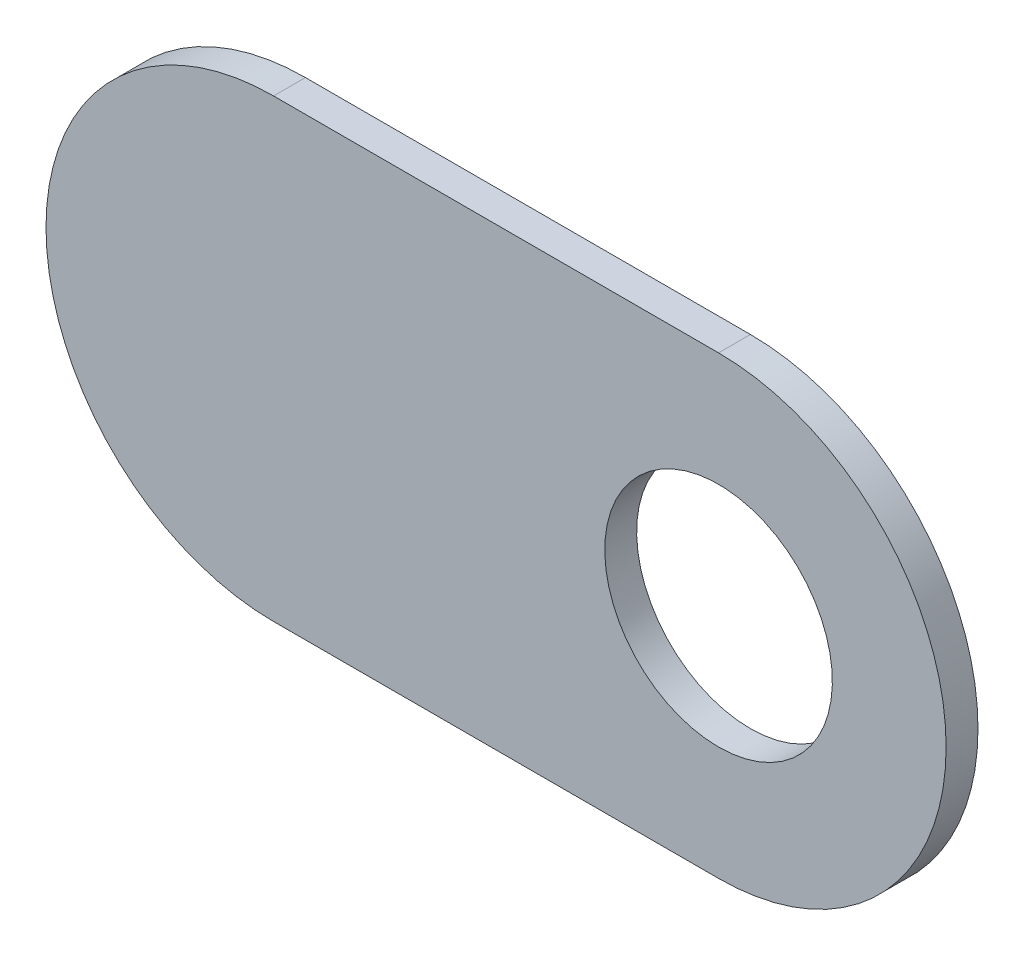
ISO-10303-21;
HEADER;
FILE_DESCRIPTION(('STEP AP214'),'2;1');
FILE_NAME('part.step','',(''),(''),'','','');
FILE_SCHEMA(('AUTOMOTIVE_DESIGN { 1 0 10303 214 1 1 1 1 }'));
ENDSEC;
DATA;
#1=APPLICATION_CONTEXT('core data for automotive mechanical design processes');
#2=APPLICATION_PROTOCOL_DEFINITION('international standard','automotive_design',2000,#1);
#3=PRODUCT_CONTEXT('',#1,'mechanical');
#4=PRODUCT('Part','Part','',(#3));
#5=PRODUCT_RELATED_PRODUCT_CATEGORY('part','',(#4));
#6=PRODUCT_DEFINITION_FORMATION('','',#4);
#7=PRODUCT_DEFINITION_CONTEXT('part definition',#1,'design');
#8=PRODUCT_DEFINITION('design','',#6,#7);
#9=PRODUCT_DEFINITION_SHAPE('','',#8);
#10=(LENGTH_UNIT() NAMED_UNIT(*) SI_UNIT(.MILLI.,.METRE.));
#11=(NAMED_UNIT(*) PLANE_ANGLE_UNIT() SI_UNIT($,.RADIAN.));
#12=(NAMED_UNIT(*) SI_UNIT($,.STERADIAN.) SOLID_ANGLE_UNIT());
#13=UNCERTAINTY_MEASURE_WITH_UNIT(LENGTH_MEASURE(1.E-05),#10,'distance_accuracy_value','');
#14=(GEOMETRIC_REPRESENTATION_CONTEXT(3) GLOBAL_UNCERTAINTY_ASSIGNED_CONTEXT((#13)) GLOBAL_UNIT_ASSIGNED_CONTEXT((#10,
#11,#12)) REPRESENTATION_CONTEXT('',''));
#15=CARTESIAN_POINT('',(0.,0.,0.));
#16=DIRECTION('',(0.,0.,1.));
#17=DIRECTION('',(1.,0.,0.));
#18=AXIS2_PLACEMENT_3D('',#15,#16,#17);
#19=CARTESIAN_POINT('',(96.84,-125.,-0.045));
#20=DIRECTION('',(0.,0.,-1.));
#21=DIRECTION('',(0.,-1.,0.));
#22=AXIS2_PLACEMENT_3D('',#19,#20,#21);
#23=CYLINDRICAL_SURFACE('',#22,0.125);
#24=CARTESIAN_POINT('',(96.84,-125.,1.6));
#25=DIRECTION('',(0.,0.,-1.));
#26=DIRECTION('',(0.,-1.,0.));
#27=AXIS2_PLACEMENT_3D('',#24,#25,#26);
#28=CIRCLE('',#27,0.125);
#29=CARTESIAN_POINT('',(96.84,-125.125,1.6));
#30=VERTEX_POINT('',#29);
#31=EDGE_CURVE('E129',#30,#30,#28,.T.);
#32=ORIENTED_EDGE('',*,*,#31,.T.);
#33=DIRECTION('',(0.,0.,1.));
#34=VECTOR('',#33,1.);
#35=CARTESIAN_POINT('',(96.84,-125.125,-0.045));
#36=LINE('',#35,#34);
#37=CARTESIAN_POINT('',(96.84,-125.125,1.635));
#38=VERTEX_POINT('',#37);
#39=EDGE_CURVE('E11',#30,#38,#36,.T.);
#40=ORIENTED_EDGE('',*,*,#39,.T.);
#41=CARTESIAN_POINT('',(96.84,-125.,1.635));
#42=DIRECTION('',(0.,0.,-1.));
#43=DIRECTION('',(0.,-1.,0.));
#44=AXIS2_PLACEMENT_3D('',#41,#42,#43);
#45=CIRCLE('',#44,0.125);
#46=EDGE_CURVE('E21',#38,#38,#45,.T.);
#47=ORIENTED_EDGE('',*,*,#46,.F.);
#48=ORIENTED_EDGE('',*,*,#39,.F.);
#49=EDGE_LOOP('',(#32,#40,#47,#48));
#50=FACE_BOUND('',#49,.T.);
#51=ADVANCED_FACE('F17',(#50),#23,.F.);
#52=CARTESIAN_POINT('',(96.351178,-125.25,1.6));
#53=DIRECTION('',(0.,1.,0.));
#54=DIRECTION('',(1.,0.,0.));
#55=AXIS2_PLACEMENT_3D('',#52,#53,#54);
#56=PLANE('',#55);
#57=DIRECTION('',(1.,0.,0.));
#58=VECTOR('',#57,1.);
#59=CARTESIAN_POINT('',(96.351178,-125.25,1.6));
#60=LINE('',#59,#58);
#61=CARTESIAN_POINT('',(96.351178,-125.25,1.6));
#62=VERTEX_POINT('',#61);
#63=CARTESIAN_POINT('',(96.84,-125.25,1.6));
#64=VERTEX_POINT('',#63);
#65=EDGE_CURVE('E120',#62,#64,#60,.T.);
#66=ORIENTED_EDGE('',*,*,#65,.T.);
#67=DIRECTION('',(0.,0.,1.));
#68=VECTOR('',#67,1.);
#69=CARTESIAN_POINT('',(96.84,-125.25,1.6));
#70=LINE('',#69,#68);
#71=CARTESIAN_POINT('',(96.84,-125.25,1.635));
#72=VERTEX_POINT('',#71);
#73=EDGE_CURVE('E85',#64,#72,#70,.T.);
#74=ORIENTED_EDGE('',*,*,#73,.T.);
#75=DIRECTION('',(1.,0.,0.));
#76=VECTOR('',#75,1.);
#77=CARTESIAN_POINT('',(96.351178,-125.25,1.635));
#78=LINE('',#77,#76);
#79=CARTESIAN_POINT('',(96.351178,-125.25,1.635));
#80=VERTEX_POINT('',#79);
#81=EDGE_CURVE('E113',#80,#72,#78,.T.);
#82=ORIENTED_EDGE('',*,*,#81,.F.);
#83=DIRECTION('',(0.,0.,1.));
#84=VECTOR('',#83,1.);
#85=CARTESIAN_POINT('',(96.351178,-125.25,1.6));
#86=LINE('',#85,#84);
#87=EDGE_CURVE('E121',#62,#80,#86,.T.);
#88=ORIENTED_EDGE('',*,*,#87,.F.);
#89=EDGE_LOOP('',(#66,#74,#82,#88));
#90=FACE_BOUND('',#89,.T.);
#91=ADVANCED_FACE('F139',(#90),#56,.F.);
#92=CARTESIAN_POINT('',(96.84,-124.75,1.635));
#93=DIRECTION('',(0.,0.,1.));
#94=DIRECTION('',(1.,0.,0.));
#95=AXIS2_PLACEMENT_3D('',#92,#93,#94);
#96=PLANE('',#95);
#97=ORIENTED_EDGE('',*,*,#46,.T.);
#98=EDGE_LOOP('',(#97));
#99=FACE_BOUND('',#98,.T.);
#100=DIRECTION('',(-1.,0.,0.));
#101=VECTOR('',#100,1.);
#102=CARTESIAN_POINT('',(96.84,-124.75,1.635));
#103=LINE('',#102,#101);
#104=CARTESIAN_POINT('',(96.84,-124.75,1.635));
#105=VERTEX_POINT('',#104);
#106=CARTESIAN_POINT('',(96.351178,-124.75,1.635));
#107=VERTEX_POINT('',#106);
#108=EDGE_CURVE('E97',#105,#107,#103,.T.);
#109=ORIENTED_EDGE('',*,*,#108,.T.);
#110=CARTESIAN_POINT('',(96.351178,-125.,1.635));
#111=DIRECTION('',(0.,0.,1.));
#112=DIRECTION('',(0.,1.,0.));
#113=AXIS2_PLACEMENT_3D('',#110,#111,#112);
#114=CIRCLE('',#113,0.25);
#115=EDGE_CURVE('E117',#107,#80,#114,.T.);
#116=ORIENTED_EDGE('',*,*,#115,.T.);
#117=ORIENTED_EDGE('',*,*,#81,.T.);
#118=CARTESIAN_POINT('',(96.84,-125.,1.635));
#119=DIRECTION('',(0.,0.,1.));
#120=DIRECTION('',(0.,-1.,0.));
#121=AXIS2_PLACEMENT_3D('',#118,#119,#120);
#122=CIRCLE('',#121,0.25);
#123=EDGE_CURVE('E89',#72,#105,#122,.T.);
#124=ORIENTED_EDGE('',*,*,#123,.T.);
#125=EDGE_LOOP('',(#109,#116,#117,#124));
#126=FACE_BOUND('',#125,.T.);
#127=ADVANCED_FACE('F19',(#99,#126),#96,.T.);
#128=CARTESIAN_POINT('',(96.84,-124.75,1.6));
#129=DIRECTION('',(0.,0.,1.));
#130=DIRECTION('',(1.,0.,0.));
#131=AXIS2_PLACEMENT_3D('',#128,#129,#130);
#132=PLANE('',#131);
#133=ORIENTED_EDGE('',*,*,#31,.F.);
#134=EDGE_LOOP('',(#133));
#135=FACE_BOUND('',#134,.T.);
#136=CARTESIAN_POINT('',(96.84,-125.,1.6));
#137=DIRECTION('',(0.,0.,1.));
#138=DIRECTION('',(0.,-1.,0.));
#139=AXIS2_PLACEMENT_3D('',#136,#137,#138);
#140=CIRCLE('',#139,0.25);
#141=CARTESIAN_POINT('',(96.84,-124.75,1.6));
#142=VERTEX_POINT('',#141);
#143=EDGE_CURVE('E78',#64,#142,#140,.T.);
#144=ORIENTED_EDGE('',*,*,#143,.F.);
#145=ORIENTED_EDGE('',*,*,#65,.F.);
#146=CARTESIAN_POINT('',(96.351178,-125.,1.6));
#147=DIRECTION('',(0.,0.,1.));
#148=DIRECTION('',(0.,1.,0.));
#149=AXIS2_PLACEMENT_3D('',#146,#147,#148);
#150=CIRCLE('',#149,0.25);
#151=CARTESIAN_POINT('',(96.351178,-124.75,1.6));
#152=VERTEX_POINT('',#151);
#153=EDGE_CURVE('E102',#152,#62,#150,.T.);
#154=ORIENTED_EDGE('',*,*,#153,.F.);
#155=DIRECTION('',(-1.,0.,0.));
#156=VECTOR('',#155,1.);
#157=CARTESIAN_POINT('',(96.84,-124.75,1.6));
#158=LINE('',#157,#156);
#159=EDGE_CURVE('E95',#142,#152,#158,.T.);
#160=ORIENTED_EDGE('',*,*,#159,.F.);
#161=EDGE_LOOP('',(#144,#145,#154,#160));
#162=FACE_BOUND('',#161,.T.);
#163=ADVANCED_FACE('F100',(#135,#162),#132,.F.);
#164=CARTESIAN_POINT('',(96.351178,-125.,1.6));
#165=DIRECTION('',(0.,0.,-1.));
#166=DIRECTION('',(0.,1.,0.));
#167=AXIS2_PLACEMENT_3D('',#164,#165,#166);
#168=CYLINDRICAL_SURFACE('',#167,0.25);
#169=ORIENTED_EDGE('',*,*,#153,.T.);
#170=ORIENTED_EDGE('',*,*,#87,.T.);
#171=ORIENTED_EDGE('',*,*,#115,.F.);
#172=DIRECTION('',(0.,0.,1.));
#173=VECTOR('',#172,1.);
#174=CARTESIAN_POINT('',(96.351178,-124.75,1.6));
#175=LINE('',#174,#173);
#176=EDGE_CURVE('E105',#152,#107,#175,.T.);
#177=ORIENTED_EDGE('',*,*,#176,.F.);
#178=EDGE_LOOP('',(#169,#170,#171,#177));
#179=FACE_BOUND('',#178,.T.);
#180=ADVANCED_FACE('F141',(#179),#168,.T.);
#181=CARTESIAN_POINT('',(96.84,-125.,1.6));
#182=DIRECTION('',(0.,0.,-1.));
#183=DIRECTION('',(0.,-1.,0.));
#184=AXIS2_PLACEMENT_3D('',#181,#182,#183);
#185=CYLINDRICAL_SURFACE('',#184,0.25);
#186=ORIENTED_EDGE('',*,*,#143,.T.);
#187=DIRECTION('',(0.,0.,1.));
#188=VECTOR('',#187,1.);
#189=CARTESIAN_POINT('',(96.84,-124.75,1.6));
#190=LINE('',#189,#188);
#191=EDGE_CURVE('E82',#142,#105,#190,.T.);
#192=ORIENTED_EDGE('',*,*,#191,.T.);
#193=ORIENTED_EDGE('',*,*,#123,.F.);
#194=ORIENTED_EDGE('',*,*,#73,.F.);
#195=EDGE_LOOP('',(#186,#192,#193,#194));
#196=FACE_BOUND('',#195,.T.);
#197=ADVANCED_FACE('F80',(#196),#185,.T.);
#198=CARTESIAN_POINT('',(96.84,-124.75,1.6));
#199=DIRECTION('',(0.,-1.,0.));
#200=DIRECTION('',(0.,0.,-1.));
#201=AXIS2_PLACEMENT_3D('',#198,#199,#200);
#202=PLANE('',#201);
#203=ORIENTED_EDGE('',*,*,#159,.T.);
#204=ORIENTED_EDGE('',*,*,#176,.T.);
#205=ORIENTED_EDGE('',*,*,#108,.F.);
#206=ORIENTED_EDGE('',*,*,#191,.F.);
#207=EDGE_LOOP('',(#203,#204,#205,#206));
#208=FACE_BOUND('',#207,.T.);
#209=ADVANCED_FACE('F93',(#208),#202,.F.);
#210=CLOSED_SHELL('',(#51,#91,#127,#163,#180,#197,#209));
#211=MANIFOLD_SOLID_BREP('B1',#210);
#212=ADVANCED_BREP_SHAPE_REPRESENTATION('',(#18,#211),#14);
#213=SHAPE_DEFINITION_REPRESENTATION(#9,#212);
ENDSEC;
END-ISO-10303-21;
